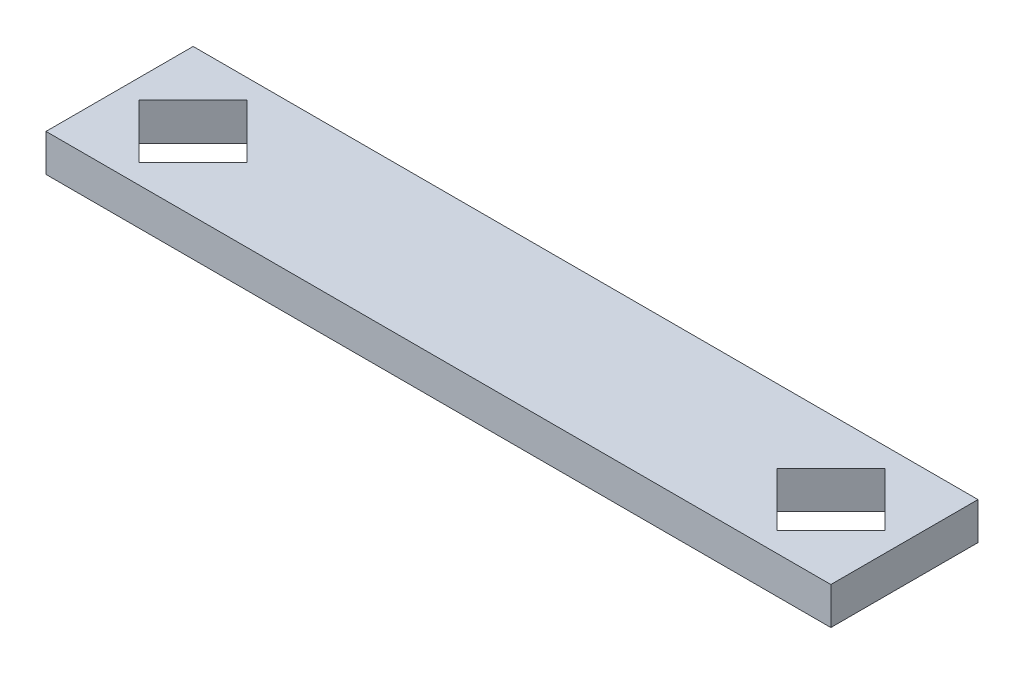
ISO-10303-21;
HEADER;
FILE_DESCRIPTION(('STEP AP214'),'2;1');
FILE_NAME('part.step','',(''),(''),'','','');
FILE_SCHEMA(('AUTOMOTIVE_DESIGN { 1 0 10303 214 1 1 1 1 }'));
ENDSEC;
DATA;
#1=APPLICATION_CONTEXT('core data for automotive mechanical design processes');
#2=APPLICATION_PROTOCOL_DEFINITION('international standard','automotive_design',2000,#1);
#3=PRODUCT_CONTEXT('',#1,'mechanical');
#4=PRODUCT('Part','Part','',(#3));
#5=PRODUCT_RELATED_PRODUCT_CATEGORY('part','',(#4));
#6=PRODUCT_DEFINITION_FORMATION('','',#4);
#7=PRODUCT_DEFINITION_CONTEXT('part definition',#1,'design');
#8=PRODUCT_DEFINITION('design','',#6,#7);
#9=PRODUCT_DEFINITION_SHAPE('','',#8);
#10=(LENGTH_UNIT() NAMED_UNIT(*) SI_UNIT(.MILLI.,.METRE.));
#11=(NAMED_UNIT(*) PLANE_ANGLE_UNIT() SI_UNIT($,.RADIAN.));
#12=(NAMED_UNIT(*) SI_UNIT($,.STERADIAN.) SOLID_ANGLE_UNIT());
#13=UNCERTAINTY_MEASURE_WITH_UNIT(LENGTH_MEASURE(1.E-05),#10,'distance_accuracy_value','');
#14=(GEOMETRIC_REPRESENTATION_CONTEXT(3) GLOBAL_UNCERTAINTY_ASSIGNED_CONTEXT((#13)) GLOBAL_UNIT_ASSIGNED_CONTEXT((#10,
#11,#12)) REPRESENTATION_CONTEXT('',''));
#15=CARTESIAN_POINT('',(0.,0.,0.));
#16=DIRECTION('',(0.,0.,1.));
#17=DIRECTION('',(1.,0.,0.));
#18=AXIS2_PLACEMENT_3D('',#15,#16,#17);
#19=CARTESIAN_POINT('',(0.,3.8,0.));
#20=DIRECTION('',(0.,-1.,0.));
#21=DIRECTION('',(0.,0.,-1.));
#22=AXIS2_PLACEMENT_3D('',#19,#20,#21);
#23=PLANE('',#22);
#24=DIRECTION('',(-0.707106781186547,0.,0.707106781186548));
#25=VECTOR('',#24,1.);
#26=CARTESIAN_POINT('',(-38.,3.8,0.));
#27=LINE('',#26,#25);
#28=CARTESIAN_POINT('',(-32.5,3.8,-5.5));
#29=VERTEX_POINT('',#28);
#30=CARTESIAN_POINT('',(-38.,3.8,0.));
#31=VERTEX_POINT('',#30);
#32=EDGE_CURVE('E160',#29,#31,#27,.T.);
#33=ORIENTED_EDGE('',*,*,#32,.F.);
#34=DIRECTION('',(-0.707106781186547,0.,-0.707106781186548));
#35=VECTOR('',#34,1.);
#36=CARTESIAN_POINT('',(-32.5,3.8,-5.5));
#37=LINE('',#36,#35);
#38=CARTESIAN_POINT('',(-27.,3.8,0.));
#39=VERTEX_POINT('',#38);
#40=EDGE_CURVE('E168',#39,#29,#37,.T.);
#41=ORIENTED_EDGE('',*,*,#40,.F.);
#42=DIRECTION('',(0.707106781186547,0.,-0.707106781186548));
#43=VECTOR('',#42,1.);
#44=CARTESIAN_POINT('',(-32.5,3.8,5.5));
#45=LINE('',#44,#43);
#46=CARTESIAN_POINT('',(-32.5,3.8,5.5));
#47=VERTEX_POINT('',#46);
#48=EDGE_CURVE('E165',#47,#39,#45,.T.);
#49=ORIENTED_EDGE('',*,*,#48,.F.);
#50=DIRECTION('',(0.707106781186547,0.,0.707106781186548));
#51=VECTOR('',#50,1.);
#52=CARTESIAN_POINT('',(-38.,3.8,0.));
#53=LINE('',#52,#51);
#54=EDGE_CURVE('E162',#31,#47,#53,.T.);
#55=ORIENTED_EDGE('',*,*,#54,.F.);
#56=EDGE_LOOP('',(#33,#41,#49,#55));
#57=FACE_BOUND('',#56,.T.);
#58=DIRECTION('',(0.,0.,-1.));
#59=VECTOR('',#58,1.);
#60=CARTESIAN_POINT('',(40.,3.8,7.5));
#61=LINE('',#60,#59);
#62=CARTESIAN_POINT('',(40.,3.8,7.5));
#63=VERTEX_POINT('',#62);
#64=CARTESIAN_POINT('',(40.,3.8,-7.5));
#65=VERTEX_POINT('',#64);
#66=EDGE_CURVE('E191',#63,#65,#61,.T.);
#67=ORIENTED_EDGE('',*,*,#66,.T.);
#68=DIRECTION('',(-1.,0.,0.));
#69=VECTOR('',#68,1.);
#70=CARTESIAN_POINT('',(-40.,3.8,-7.5));
#71=LINE('',#70,#69);
#72=CARTESIAN_POINT('',(-40.,3.8,-7.5));
#73=VERTEX_POINT('',#72);
#74=EDGE_CURVE('E194',#65,#73,#71,.T.);
#75=ORIENTED_EDGE('',*,*,#74,.T.);
#76=DIRECTION('',(0.,0.,1.));
#77=VECTOR('',#76,1.);
#78=CARTESIAN_POINT('',(-40.,3.8,7.5));
#79=LINE('',#78,#77);
#80=CARTESIAN_POINT('',(-40.,3.8,7.5));
#81=VERTEX_POINT('',#80);
#82=EDGE_CURVE('E197',#73,#81,#79,.T.);
#83=ORIENTED_EDGE('',*,*,#82,.T.);
#84=DIRECTION('',(1.,0.,0.));
#85=VECTOR('',#84,1.);
#86=CARTESIAN_POINT('',(-40.,3.8,7.5));
#87=LINE('',#86,#85);
#88=EDGE_CURVE('E199',#81,#63,#87,.T.);
#89=ORIENTED_EDGE('',*,*,#88,.T.);
#90=EDGE_LOOP('',(#67,#75,#83,#89));
#91=FACE_BOUND('',#90,.T.);
#92=DIRECTION('',(0.707106781186547,0.,-0.707106781186548));
#93=VECTOR('',#92,1.);
#94=CARTESIAN_POINT('',(38.,3.8,0.));
#95=LINE('',#94,#93);
#96=CARTESIAN_POINT('',(32.5,3.8,5.5));
#97=VERTEX_POINT('',#96);
#98=CARTESIAN_POINT('',(38.,3.8,0.));
#99=VERTEX_POINT('',#98);
#100=EDGE_CURVE('E124',#97,#99,#95,.T.);
#101=ORIENTED_EDGE('',*,*,#100,.F.);
#102=DIRECTION('',(0.707106781186547,0.,0.707106781186548));
#103=VECTOR('',#102,1.);
#104=CARTESIAN_POINT('',(32.5,3.8,5.5));
#105=LINE('',#104,#103);
#106=CARTESIAN_POINT('',(27.,3.8,0.));
#107=VERTEX_POINT('',#106);
#108=EDGE_CURVE('E146',#107,#97,#105,.T.);
#109=ORIENTED_EDGE('',*,*,#108,.F.);
#110=DIRECTION('',(-0.707106781186547,0.,0.707106781186548));
#111=VECTOR('',#110,1.);
#112=CARTESIAN_POINT('',(32.5,3.8,-5.5));
#113=LINE('',#112,#111);
#114=CARTESIAN_POINT('',(32.5,3.8,-5.5));
#115=VERTEX_POINT('',#114);
#116=EDGE_CURVE('E144',#115,#107,#113,.T.);
#117=ORIENTED_EDGE('',*,*,#116,.F.);
#118=DIRECTION('',(-0.707106781186547,0.,-0.707106781186548));
#119=VECTOR('',#118,1.);
#120=CARTESIAN_POINT('',(38.,3.8,0.));
#121=LINE('',#120,#119);
#122=EDGE_CURVE('E132',#99,#115,#121,.T.);
#123=ORIENTED_EDGE('',*,*,#122,.F.);
#124=EDGE_LOOP('',(#101,#109,#117,#123));
#125=FACE_BOUND('',#124,.T.);
#126=ADVANCED_FACE('F35',(#57,#91,#125),#23,.F.);
#127=CARTESIAN_POINT('',(0.,0.,0.));
#128=DIRECTION('',(0.,-1.,0.));
#129=DIRECTION('',(0.,0.,-1.));
#130=AXIS2_PLACEMENT_3D('',#127,#128,#129);
#131=PLANE('',#130);
#132=DIRECTION('',(0.,0.,-1.));
#133=VECTOR('',#132,1.);
#134=CARTESIAN_POINT('',(40.,0.,7.5));
#135=LINE('',#134,#133);
#136=CARTESIAN_POINT('',(40.,0.,7.5));
#137=VERTEX_POINT('',#136);
#138=CARTESIAN_POINT('',(40.,0.,-7.5));
#139=VERTEX_POINT('',#138);
#140=EDGE_CURVE('E190',#137,#139,#135,.T.);
#141=ORIENTED_EDGE('',*,*,#140,.F.);
#142=DIRECTION('',(1.,0.,0.));
#143=VECTOR('',#142,1.);
#144=CARTESIAN_POINT('',(-40.,0.,7.5));
#145=LINE('',#144,#143);
#146=CARTESIAN_POINT('',(-40.,0.,7.5));
#147=VERTEX_POINT('',#146);
#148=EDGE_CURVE('E195',#147,#137,#145,.T.);
#149=ORIENTED_EDGE('',*,*,#148,.F.);
#150=DIRECTION('',(0.,0.,1.));
#151=VECTOR('',#150,1.);
#152=CARTESIAN_POINT('',(-40.,0.,7.5));
#153=LINE('',#152,#151);
#154=CARTESIAN_POINT('',(-40.,0.,-7.5));
#155=VERTEX_POINT('',#154);
#156=EDGE_CURVE('E206',#155,#147,#153,.T.);
#157=ORIENTED_EDGE('',*,*,#156,.F.);
#158=DIRECTION('',(-1.,0.,0.));
#159=VECTOR('',#158,1.);
#160=CARTESIAN_POINT('',(-40.,0.,-7.5));
#161=LINE('',#160,#159);
#162=EDGE_CURVE('E204',#139,#155,#161,.T.);
#163=ORIENTED_EDGE('',*,*,#162,.F.);
#164=EDGE_LOOP('',(#141,#149,#157,#163));
#165=FACE_BOUND('',#164,.T.);
#166=DIRECTION('',(-0.707106781186547,0.,-0.707106781186548));
#167=VECTOR('',#166,1.);
#168=CARTESIAN_POINT('',(-32.5,0.,-5.5));
#169=LINE('',#168,#167);
#170=CARTESIAN_POINT('',(-27.,0.,0.));
#171=VERTEX_POINT('',#170);
#172=CARTESIAN_POINT('',(-32.5,0.,-5.5));
#173=VERTEX_POINT('',#172);
#174=EDGE_CURVE('E163',#171,#173,#169,.T.);
#175=ORIENTED_EDGE('',*,*,#174,.T.);
#176=DIRECTION('',(-0.707106781186547,0.,0.707106781186548));
#177=VECTOR('',#176,1.);
#178=CARTESIAN_POINT('',(-38.,0.,0.));
#179=LINE('',#178,#177);
#180=CARTESIAN_POINT('',(-38.,0.,0.));
#181=VERTEX_POINT('',#180);
#182=EDGE_CURVE('E140',#173,#181,#179,.T.);
#183=ORIENTED_EDGE('',*,*,#182,.T.);
#184=DIRECTION('',(0.707106781186547,0.,0.707106781186548));
#185=VECTOR('',#184,1.);
#186=CARTESIAN_POINT('',(-38.,0.,0.));
#187=LINE('',#186,#185);
#188=CARTESIAN_POINT('',(-32.5,0.,5.5));
#189=VERTEX_POINT('',#188);
#190=EDGE_CURVE('E173',#181,#189,#187,.T.);
#191=ORIENTED_EDGE('',*,*,#190,.T.);
#192=DIRECTION('',(0.707106781186547,0.,-0.707106781186548));
#193=VECTOR('',#192,1.);
#194=CARTESIAN_POINT('',(-32.5,0.,5.5));
#195=LINE('',#194,#193);
#196=EDGE_CURVE('E176',#189,#171,#195,.T.);
#197=ORIENTED_EDGE('',*,*,#196,.T.);
#198=EDGE_LOOP('',(#175,#183,#191,#197));
#199=FACE_BOUND('',#198,.T.);
#200=DIRECTION('',(0.707106781186547,0.,0.707106781186548));
#201=VECTOR('',#200,1.);
#202=CARTESIAN_POINT('',(32.5,0.,5.5));
#203=LINE('',#202,#201);
#204=CARTESIAN_POINT('',(27.,0.,0.));
#205=VERTEX_POINT('',#204);
#206=CARTESIAN_POINT('',(32.5,0.,5.5));
#207=VERTEX_POINT('',#206);
#208=EDGE_CURVE('E133',#205,#207,#203,.T.);
#209=ORIENTED_EDGE('',*,*,#208,.T.);
#210=DIRECTION('',(0.707106781186547,0.,-0.707106781186548));
#211=VECTOR('',#210,1.);
#212=CARTESIAN_POINT('',(38.,0.,0.));
#213=LINE('',#212,#211);
#214=CARTESIAN_POINT('',(38.,0.,0.));
#215=VERTEX_POINT('',#214);
#216=EDGE_CURVE('E58',#207,#215,#213,.T.);
#217=ORIENTED_EDGE('',*,*,#216,.T.);
#218=DIRECTION('',(-0.707106781186547,0.,-0.707106781186548));
#219=VECTOR('',#218,1.);
#220=CARTESIAN_POINT('',(38.,0.,0.));
#221=LINE('',#220,#219);
#222=CARTESIAN_POINT('',(32.5,0.,-5.5));
#223=VERTEX_POINT('',#222);
#224=EDGE_CURVE('E139',#215,#223,#221,.T.);
#225=ORIENTED_EDGE('',*,*,#224,.T.);
#226=DIRECTION('',(-0.707106781186547,0.,0.707106781186548));
#227=VECTOR('',#226,1.);
#228=CARTESIAN_POINT('',(32.5,0.,-5.5));
#229=LINE('',#228,#227);
#230=EDGE_CURVE('E152',#223,#205,#229,.T.);
#231=ORIENTED_EDGE('',*,*,#230,.T.);
#232=EDGE_LOOP('',(#209,#217,#225,#231));
#233=FACE_BOUND('',#232,.T.);
#234=ADVANCED_FACE('F224',(#165,#199,#233),#131,.T.);
#235=CARTESIAN_POINT('',(40.,3.8,7.5));
#236=DIRECTION('',(-1.,0.,0.));
#237=DIRECTION('',(0.,0.,1.));
#238=AXIS2_PLACEMENT_3D('',#235,#236,#237);
#239=PLANE('',#238);
#240=ORIENTED_EDGE('',*,*,#140,.T.);
#241=DIRECTION('',(0.,-1.,0.));
#242=VECTOR('',#241,1.);
#243=CARTESIAN_POINT('',(40.,3.8,-7.5));
#244=LINE('',#243,#242);
#245=EDGE_CURVE('E11',#65,#139,#244,.T.);
#246=ORIENTED_EDGE('',*,*,#245,.F.);
#247=ORIENTED_EDGE('',*,*,#66,.F.);
#248=DIRECTION('',(0.,-1.,0.));
#249=VECTOR('',#248,1.);
#250=CARTESIAN_POINT('',(40.,3.8,7.5));
#251=LINE('',#250,#249);
#252=EDGE_CURVE('E201',#63,#137,#251,.T.);
#253=ORIENTED_EDGE('',*,*,#252,.T.);
#254=EDGE_LOOP('',(#240,#246,#247,#253));
#255=FACE_BOUND('',#254,.T.);
#256=ADVANCED_FACE('F37',(#255),#239,.F.);
#257=CARTESIAN_POINT('',(-40.,3.8,-7.5));
#258=DIRECTION('',(0.,0.,1.));
#259=DIRECTION('',(1.,0.,0.));
#260=AXIS2_PLACEMENT_3D('',#257,#258,#259);
#261=PLANE('',#260);
#262=ORIENTED_EDGE('',*,*,#162,.T.);
#263=DIRECTION('',(0.,-1.,0.));
#264=VECTOR('',#263,1.);
#265=CARTESIAN_POINT('',(-40.,3.8,-7.5));
#266=LINE('',#265,#264);
#267=EDGE_CURVE('E43',#73,#155,#266,.T.);
#268=ORIENTED_EDGE('',*,*,#267,.F.);
#269=ORIENTED_EDGE('',*,*,#74,.F.);
#270=ORIENTED_EDGE('',*,*,#245,.T.);
#271=EDGE_LOOP('',(#262,#268,#269,#270));
#272=FACE_BOUND('',#271,.T.);
#273=ADVANCED_FACE('F234',(#272),#261,.F.);
#274=CARTESIAN_POINT('',(-40.,3.8,7.5));
#275=DIRECTION('',(1.,0.,0.));
#276=DIRECTION('',(0.,0.,-1.));
#277=AXIS2_PLACEMENT_3D('',#274,#275,#276);
#278=PLANE('',#277);
#279=ORIENTED_EDGE('',*,*,#156,.T.);
#280=DIRECTION('',(0.,-1.,0.));
#281=VECTOR('',#280,1.);
#282=CARTESIAN_POINT('',(-40.,3.8,7.5));
#283=LINE('',#282,#281);
#284=EDGE_CURVE('E211',#81,#147,#283,.T.);
#285=ORIENTED_EDGE('',*,*,#284,.F.);
#286=ORIENTED_EDGE('',*,*,#82,.F.);
#287=ORIENTED_EDGE('',*,*,#267,.T.);
#288=EDGE_LOOP('',(#279,#285,#286,#287));
#289=FACE_BOUND('',#288,.T.);
#290=ADVANCED_FACE('F218',(#289),#278,.F.);
#291=CARTESIAN_POINT('',(-40.,3.8,7.5));
#292=DIRECTION('',(0.,0.,-1.));
#293=DIRECTION('',(-1.,0.,0.));
#294=AXIS2_PLACEMENT_3D('',#291,#292,#293);
#295=PLANE('',#294);
#296=ORIENTED_EDGE('',*,*,#148,.T.);
#297=ORIENTED_EDGE('',*,*,#252,.F.);
#298=ORIENTED_EDGE('',*,*,#88,.F.);
#299=ORIENTED_EDGE('',*,*,#284,.T.);
#300=EDGE_LOOP('',(#296,#297,#298,#299));
#301=FACE_BOUND('',#300,.T.);
#302=ADVANCED_FACE('F228',(#301),#295,.F.);
#303=CARTESIAN_POINT('',(-38.,3.8,0.));
#304=DIRECTION('',(0.707106781186548,0.,0.707106781186547));
#305=DIRECTION('',(0.707106781186547,0.,-0.707106781186548));
#306=AXIS2_PLACEMENT_3D('',#303,#304,#305);
#307=PLANE('',#306);
#308=ORIENTED_EDGE('',*,*,#182,.F.);
#309=DIRECTION('',(0.,-1.,0.));
#310=VECTOR('',#309,1.);
#311=CARTESIAN_POINT('',(-32.5,3.8,-5.5));
#312=LINE('',#311,#310);
#313=EDGE_CURVE('E170',#29,#173,#312,.T.);
#314=ORIENTED_EDGE('',*,*,#313,.F.);
#315=ORIENTED_EDGE('',*,*,#32,.T.);
#316=DIRECTION('',(0.,-1.,0.));
#317=VECTOR('',#316,1.);
#318=CARTESIAN_POINT('',(-38.,3.8,0.));
#319=LINE('',#318,#317);
#320=EDGE_CURVE('E187',#31,#181,#319,.T.);
#321=ORIENTED_EDGE('',*,*,#320,.T.);
#322=EDGE_LOOP('',(#308,#314,#315,#321));
#323=FACE_BOUND('',#322,.T.);
#324=ADVANCED_FACE('F250',(#323),#307,.T.);
#325=CARTESIAN_POINT('',(-38.,3.8,0.));
#326=DIRECTION('',(0.707106781186548,0.,-0.707106781186547));
#327=DIRECTION('',(-0.707106781186547,0.,-0.707106781186548));
#328=AXIS2_PLACEMENT_3D('',#325,#326,#327);
#329=PLANE('',#328);
#330=ORIENTED_EDGE('',*,*,#190,.F.);
#331=ORIENTED_EDGE('',*,*,#320,.F.);
#332=ORIENTED_EDGE('',*,*,#54,.T.);
#333=DIRECTION('',(0.,-1.,0.));
#334=VECTOR('',#333,1.);
#335=CARTESIAN_POINT('',(-32.5,3.8,5.5));
#336=LINE('',#335,#334);
#337=EDGE_CURVE('E185',#47,#189,#336,.T.);
#338=ORIENTED_EDGE('',*,*,#337,.T.);
#339=EDGE_LOOP('',(#330,#331,#332,#338));
#340=FACE_BOUND('',#339,.T.);
#341=ADVANCED_FACE('F257',(#340),#329,.T.);
#342=CARTESIAN_POINT('',(-32.5,3.8,5.5));
#343=DIRECTION('',(-0.707106781186548,0.,-0.707106781186547));
#344=DIRECTION('',(-0.707106781186547,0.,0.707106781186548));
#345=AXIS2_PLACEMENT_3D('',#342,#343,#344);
#346=PLANE('',#345);
#347=ORIENTED_EDGE('',*,*,#196,.F.);
#348=ORIENTED_EDGE('',*,*,#337,.F.);
#349=ORIENTED_EDGE('',*,*,#48,.T.);
#350=DIRECTION('',(0.,-1.,0.));
#351=VECTOR('',#350,1.);
#352=CARTESIAN_POINT('',(-27.,3.8,0.));
#353=LINE('',#352,#351);
#354=EDGE_CURVE('E183',#39,#171,#353,.T.);
#355=ORIENTED_EDGE('',*,*,#354,.T.);
#356=EDGE_LOOP('',(#347,#348,#349,#355));
#357=FACE_BOUND('',#356,.T.);
#358=ADVANCED_FACE('F262',(#357),#346,.T.);
#359=CARTESIAN_POINT('',(-32.5,3.8,-5.5));
#360=DIRECTION('',(-0.707106781186548,0.,0.707106781186547));
#361=DIRECTION('',(0.707106781186547,0.,0.707106781186548));
#362=AXIS2_PLACEMENT_3D('',#359,#360,#361);
#363=PLANE('',#362);
#364=ORIENTED_EDGE('',*,*,#174,.F.);
#365=ORIENTED_EDGE('',*,*,#354,.F.);
#366=ORIENTED_EDGE('',*,*,#40,.T.);
#367=ORIENTED_EDGE('',*,*,#313,.T.);
#368=EDGE_LOOP('',(#364,#365,#366,#367));
#369=FACE_BOUND('',#368,.T.);
#370=ADVANCED_FACE('F268',(#369),#363,.T.);
#371=CARTESIAN_POINT('',(38.,3.8,0.));
#372=DIRECTION('',(-0.707106781186548,0.,-0.707106781186547));
#373=DIRECTION('',(-0.707106781186547,0.,0.707106781186548));
#374=AXIS2_PLACEMENT_3D('',#371,#372,#373);
#375=PLANE('',#374);
#376=ORIENTED_EDGE('',*,*,#216,.F.);
#377=DIRECTION('',(0.,-1.,0.));
#378=VECTOR('',#377,1.);
#379=CARTESIAN_POINT('',(32.5,3.8,5.5));
#380=LINE('',#379,#378);
#381=EDGE_CURVE('E128',#97,#207,#380,.T.);
#382=ORIENTED_EDGE('',*,*,#381,.F.);
#383=ORIENTED_EDGE('',*,*,#100,.T.);
#384=DIRECTION('',(0.,-1.,0.));
#385=VECTOR('',#384,1.);
#386=CARTESIAN_POINT('',(38.,3.8,0.));
#387=LINE('',#386,#385);
#388=EDGE_CURVE('E127',#99,#215,#387,.T.);
#389=ORIENTED_EDGE('',*,*,#388,.T.);
#390=EDGE_LOOP('',(#376,#382,#383,#389));
#391=FACE_BOUND('',#390,.T.);
#392=ADVANCED_FACE('F126',(#391),#375,.T.);
#393=CARTESIAN_POINT('',(38.,3.8,0.));
#394=DIRECTION('',(-0.707106781186548,0.,0.707106781186547));
#395=DIRECTION('',(0.707106781186547,0.,0.707106781186548));
#396=AXIS2_PLACEMENT_3D('',#393,#394,#395);
#397=PLANE('',#396);
#398=ORIENTED_EDGE('',*,*,#224,.F.);
#399=ORIENTED_EDGE('',*,*,#388,.F.);
#400=ORIENTED_EDGE('',*,*,#122,.T.);
#401=DIRECTION('',(0.,-1.,0.));
#402=VECTOR('',#401,1.);
#403=CARTESIAN_POINT('',(32.5,3.8,-5.5));
#404=LINE('',#403,#402);
#405=EDGE_CURVE('E141',#115,#223,#404,.T.);
#406=ORIENTED_EDGE('',*,*,#405,.T.);
#407=EDGE_LOOP('',(#398,#399,#400,#406));
#408=FACE_BOUND('',#407,.T.);
#409=ADVANCED_FACE('F136',(#408),#397,.T.);
#410=CARTESIAN_POINT('',(32.5,3.8,-5.5));
#411=DIRECTION('',(0.707106781186548,0.,0.707106781186547));
#412=DIRECTION('',(0.707106781186547,0.,-0.707106781186548));
#413=AXIS2_PLACEMENT_3D('',#410,#411,#412);
#414=PLANE('',#413);
#415=ORIENTED_EDGE('',*,*,#230,.F.);
#416=ORIENTED_EDGE('',*,*,#405,.F.);
#417=ORIENTED_EDGE('',*,*,#116,.T.);
#418=DIRECTION('',(0.,-1.,0.));
#419=VECTOR('',#418,1.);
#420=CARTESIAN_POINT('',(27.,3.8,0.));
#421=LINE('',#420,#419);
#422=EDGE_CURVE('E50',#107,#205,#421,.T.);
#423=ORIENTED_EDGE('',*,*,#422,.T.);
#424=EDGE_LOOP('',(#415,#416,#417,#423));
#425=FACE_BOUND('',#424,.T.);
#426=ADVANCED_FACE('F287',(#425),#414,.T.);
#427=CARTESIAN_POINT('',(32.5,3.8,5.5));
#428=DIRECTION('',(0.707106781186548,0.,-0.707106781186547));
#429=DIRECTION('',(-0.707106781186547,0.,-0.707106781186548));
#430=AXIS2_PLACEMENT_3D('',#427,#428,#429);
#431=PLANE('',#430);
#432=ORIENTED_EDGE('',*,*,#208,.F.);
#433=ORIENTED_EDGE('',*,*,#422,.F.);
#434=ORIENTED_EDGE('',*,*,#108,.T.);
#435=ORIENTED_EDGE('',*,*,#381,.T.);
#436=EDGE_LOOP('',(#432,#433,#434,#435));
#437=FACE_BOUND('',#436,.T.);
#438=ADVANCED_FACE('F290',(#437),#431,.T.);
#439=CLOSED_SHELL('',(#126,#234,#256,#273,#290,#302,#324,#341,#358,#370,#392,#409,#426,#438));
#440=MANIFOLD_SOLID_BREP('B2',#439);
#441=ADVANCED_BREP_SHAPE_REPRESENTATION('',(#18,#440),#14);
#442=SHAPE_DEFINITION_REPRESENTATION(#9,#441);
ENDSEC;
END-ISO-10303-21;
